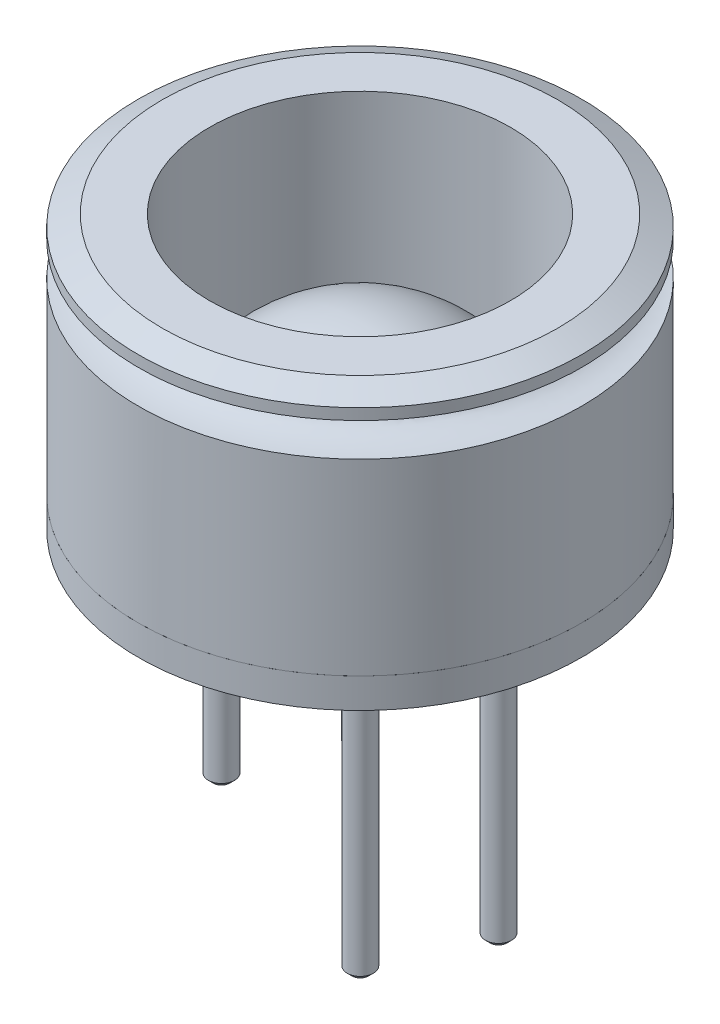
ISO-10303-21;
HEADER;
FILE_DESCRIPTION(('STEP AP214'),'2;1');
FILE_NAME('part.step','',(''),(''),'','','');
FILE_SCHEMA(('AUTOMOTIVE_DESIGN { 1 0 10303 214 1 1 1 1 }'));
ENDSEC;
DATA;
#1=APPLICATION_CONTEXT('core data for automotive mechanical design processes');
#2=APPLICATION_PROTOCOL_DEFINITION('international standard','automotive_design',2000,#1);
#3=PRODUCT_CONTEXT('',#1,'mechanical');
#4=PRODUCT('Part','Part','',(#3));
#5=PRODUCT_RELATED_PRODUCT_CATEGORY('part','',(#4));
#6=PRODUCT_DEFINITION_FORMATION('','',#4);
#7=PRODUCT_DEFINITION_CONTEXT('part definition',#1,'design');
#8=PRODUCT_DEFINITION('design','',#6,#7);
#9=PRODUCT_DEFINITION_SHAPE('','',#8);
#10=(LENGTH_UNIT() NAMED_UNIT(*) SI_UNIT(.MILLI.,.METRE.));
#11=(NAMED_UNIT(*) PLANE_ANGLE_UNIT() SI_UNIT($,.RADIAN.));
#12=(NAMED_UNIT(*) SI_UNIT($,.STERADIAN.) SOLID_ANGLE_UNIT());
#13=UNCERTAINTY_MEASURE_WITH_UNIT(LENGTH_MEASURE(1.E-05),#10,'distance_accuracy_value','');
#14=(GEOMETRIC_REPRESENTATION_CONTEXT(3) GLOBAL_UNCERTAINTY_ASSIGNED_CONTEXT((#13)) GLOBAL_UNIT_ASSIGNED_CONTEXT((#10,
#11,#12)) REPRESENTATION_CONTEXT('',''));
#15=CARTESIAN_POINT('',(0.,0.,0.));
#16=DIRECTION('',(0.,0.,1.));
#17=DIRECTION('',(1.,0.,0.));
#18=AXIS2_PLACEMENT_3D('',#15,#16,#17);
#19=CARTESIAN_POINT('',(0.,5.52740000002085,0.));
#20=DIRECTION('',(0.,-1.,0.));
#21=DIRECTION('',(0.,0.,-1.));
#22=AXIS2_PLACEMENT_3D('',#19,#20,#21);
#23=CONICAL_SURFACE('',#22,4.67,1.1314354395103);
#24=CARTESIAN_POINT('',(0.,5.5274,0.));
#25=DIRECTION('',(0.,-1.,0.));
#26=DIRECTION('',(1.,0.,0.));
#27=AXIS2_PLACEMENT_3D('',#24,#25,#26);
#28=CIRCLE('',#27,4.67);
#29=CARTESIAN_POINT('',(4.67,5.5274,0.));
#30=VERTEX_POINT('',#29);
#31=EDGE_CURVE('P0_E73',#30,#30,#28,.T.);
#32=ORIENTED_EDGE('',*,*,#31,.F.);
#33=EDGE_LOOP('',(#32));
#34=FACE_BOUND('',#33,.T.);
#35=CARTESIAN_POINT('',(0.,5.76240000002659,0.));
#36=DIRECTION('',(0.,1.,0.));
#37=DIRECTION('',(-1.,0.,0.));
#38=AXIS2_PLACEMENT_3D('',#35,#36,#37);
#39=CIRCLE('',#38,4.16999999998779);
#40=CARTESIAN_POINT('',(-4.16999999998779,5.76240000002659,0.));
#41=VERTEX_POINT('',#40);
#42=EDGE_CURVE('P0_E68',#41,#41,#39,.T.);
#43=ORIENTED_EDGE('',*,*,#42,.F.);
#44=EDGE_LOOP('',(#43));
#45=FACE_BOUND('',#44,.T.);
#46=ADVANCED_FACE('P0_F39',(#34,#45),#23,.T.);
#47=CARTESIAN_POINT('',(0.,5.7624,0.));
#48=DIRECTION('',(0.,-1.,0.));
#49=DIRECTION('',(0.,0.,-1.));
#50=AXIS2_PLACEMENT_3D('',#47,#48,#49);
#51=CYLINDRICAL_SURFACE('',#50,4.67);
#52=CARTESIAN_POINT('',(0.,5.2924,0.));
#53=DIRECTION('',(0.,1.,0.));
#54=DIRECTION('',(-1.,0.,0.));
#55=AXIS2_PLACEMENT_3D('',#52,#53,#54);
#56=CIRCLE('',#55,4.67);
#57=CARTESIAN_POINT('',(-4.67,5.2924,0.));
#58=VERTEX_POINT('',#57);
#59=EDGE_CURVE('P0_E63',#58,#58,#56,.T.);
#60=ORIENTED_EDGE('',*,*,#59,.T.);
#61=EDGE_LOOP('',(#60));
#62=FACE_BOUND('',#61,.T.);
#63=ORIENTED_EDGE('',*,*,#31,.T.);
#64=EDGE_LOOP('',(#63));
#65=FACE_BOUND('',#64,.T.);
#66=ADVANCED_FACE('P0_F80',(#62,#65),#51,.T.);
#67=CARTESIAN_POINT('',(0.,5.7624,0.));
#68=DIRECTION('',(0.,1.,0.));
#69=DIRECTION('',(0.,0.,1.));
#70=AXIS2_PLACEMENT_3D('',#67,#68,#69);
#71=PLANE('',#70);
#72=CARTESIAN_POINT('',(0.,5.7624,0.));
#73=DIRECTION('',(0.,-1.,0.));
#74=DIRECTION('',(0.,0.,-1.));
#75=AXIS2_PLACEMENT_3D('',#72,#73,#74);
#76=CIRCLE('',#75,3.17);
#77=CARTESIAN_POINT('',(0.,5.7624,-3.17));
#78=VERTEX_POINT('',#77);
#79=EDGE_CURVE('P0_E43',#78,#78,#76,.T.);
#80=ORIENTED_EDGE('',*,*,#79,.T.);
#81=EDGE_LOOP('',(#80));
#82=FACE_BOUND('',#81,.T.);
#83=ORIENTED_EDGE('',*,*,#42,.T.);
#84=EDGE_LOOP('',(#83));
#85=FACE_BOUND('',#84,.T.);
#86=ADVANCED_FACE('P0_F87',(#82,#85),#71,.T.);
#87=CARTESIAN_POINT('',(0.,5.7624,0.));
#88=DIRECTION('',(0.,-1.,0.));
#89=DIRECTION('',(0.,0.,-1.));
#90=AXIS2_PLACEMENT_3D('',#87,#88,#89);
#91=CYLINDRICAL_SURFACE('',#90,3.17);
#92=CARTESIAN_POINT('',(0.,0.63,0.));
#93=DIRECTION('',(0.,-1.,0.));
#94=DIRECTION('',(0.,0.,-1.));
#95=AXIS2_PLACEMENT_3D('',#92,#93,#94);
#96=CIRCLE('',#95,3.17);
#97=CARTESIAN_POINT('',(0.,0.63,-3.17));
#98=VERTEX_POINT('',#97);
#99=EDGE_CURVE('P0_E54',#98,#98,#96,.T.);
#100=ORIENTED_EDGE('',*,*,#99,.T.);
#101=EDGE_LOOP('',(#100));
#102=FACE_BOUND('',#101,.T.);
#103=ORIENTED_EDGE('',*,*,#79,.F.);
#104=EDGE_LOOP('',(#103));
#105=FACE_BOUND('',#104,.T.);
#106=ADVANCED_FACE('P0_F89',(#102,#105),#91,.F.);
#107=CARTESIAN_POINT('',(0.,4.9399,5.42));
#108=CARTESIAN_POINT('',(10.84,4.9399,5.42));
#109=CARTESIAN_POINT('',(10.84,4.9399,-5.42));
#110=CARTESIAN_POINT('',(0.,4.9399,-5.42));
#111=CARTESIAN_POINT('',(-10.84,4.9399,-5.42));
#112=CARTESIAN_POINT('',(-10.84,4.9399,5.42));
#113=CARTESIAN_POINT('',(0.,4.9399,5.42));
#114=CARTESIAN_POINT('',(0.,4.2349,5.42));
#115=CARTESIAN_POINT('',(10.84,4.2349,5.42));
#116=CARTESIAN_POINT('',(10.84,4.2349,-5.42));
#117=CARTESIAN_POINT('',(0.,4.2349,-5.42));
#118=CARTESIAN_POINT('',(-10.84,4.2349,-5.42));
#119=CARTESIAN_POINT('',(-10.84,4.2349,5.42));
#120=CARTESIAN_POINT('',(0.,4.2349,5.42));
#121=CARTESIAN_POINT('',(0.,4.2349,3.92));
#122=CARTESIAN_POINT('',(7.84,4.2349,3.92));
#123=CARTESIAN_POINT('',(7.84,4.2349,-3.92));
#124=CARTESIAN_POINT('',(0.,4.2349,-3.92));
#125=CARTESIAN_POINT('',(-7.84,4.2349,-3.92));
#126=CARTESIAN_POINT('',(-7.84,4.2349,3.92));
#127=CARTESIAN_POINT('',(0.,4.2349,3.92));
#128=CARTESIAN_POINT('',(0.,4.9399,3.92));
#129=CARTESIAN_POINT('',(7.84,4.9399,3.92));
#130=CARTESIAN_POINT('',(7.84,4.9399,-3.92));
#131=CARTESIAN_POINT('',(0.,4.9399,-3.92));
#132=CARTESIAN_POINT('',(-7.84,4.9399,-3.92));
#133=CARTESIAN_POINT('',(-7.84,4.9399,3.92));
#134=CARTESIAN_POINT('',(0.,4.9399,3.92));
#135=CARTESIAN_POINT('',(0.,5.6449,3.92));
#136=CARTESIAN_POINT('',(7.84,5.6449,3.92));
#137=CARTESIAN_POINT('',(7.84,5.6449,-3.92));
#138=CARTESIAN_POINT('',(0.,5.6449,-3.92));
#139=CARTESIAN_POINT('',(-7.84,5.6449,-3.92));
#140=CARTESIAN_POINT('',(-7.84,5.6449,3.92));
#141=CARTESIAN_POINT('',(0.,5.6449,3.92));
#142=CARTESIAN_POINT('',(0.,5.6449,5.42));
#143=CARTESIAN_POINT('',(10.84,5.6449,5.42));
#144=CARTESIAN_POINT('',(10.84,5.6449,-5.42));
#145=CARTESIAN_POINT('',(0.,5.6449,-5.42));
#146=CARTESIAN_POINT('',(-10.84,5.6449,-5.42));
#147=CARTESIAN_POINT('',(-10.84,5.6449,5.42));
#148=CARTESIAN_POINT('',(0.,5.6449,5.42));
#149=CARTESIAN_POINT('',(0.,4.9399,5.42));
#150=CARTESIAN_POINT('',(10.84,4.9399,5.42));
#151=CARTESIAN_POINT('',(10.84,4.9399,-5.42));
#152=CARTESIAN_POINT('',(0.,4.9399,-5.42));
#153=CARTESIAN_POINT('',(-10.84,4.9399,-5.42));
#154=CARTESIAN_POINT('',(-10.84,4.9399,5.42));
#155=CARTESIAN_POINT('',(0.,4.9399,5.42));
#156=(BOUNDED_SURFACE() B_SPLINE_SURFACE(3,3,((#107,#108,#109,#110,#111,#112,#113),(#114,#115,
#116,#117,#118,#119,#120),(#121,#122,#123,#124,#125,#126,#127),(#128,#129,#130,#131,#132,#133,
#134),(#135,#136,#137,#138,#139,#140,#141),(#142,#143,#144,#145,#146,#147,#148),(#149,#150,#151,
#152,#153,#154,#155)),.UNSPECIFIED.,.T.,.T.,.F.) B_SPLINE_SURFACE_WITH_KNOTS((4,3,4),(4,3,4),
(0.,0.5,1.),(0.,0.5,1.),
.UNSPECIFIED.) GEOMETRIC_REPRESENTATION_ITEM() RATIONAL_B_SPLINE_SURFACE(((1.,0.333333333333333,
0.333333333333333,1.,0.333333333333333,0.333333333333333,1.),(0.333333333333333,
0.111111111111111,0.111111111111111,0.333333333333333,0.111111111111111,0.111111111111111,
0.333333333333333),(0.333333333333333,0.111111111111111,0.111111111111111,0.333333333333333,
0.111111111111111,0.111111111111111,0.333333333333333),(1.,0.333333333333333,0.333333333333333,
1.,0.333333333333333,0.333333333333333,1.),(0.333333333333333,0.111111111111111,
0.111111111111111,0.333333333333333,0.111111111111111,0.111111111111111,0.333333333333333),
(0.333333333333333,0.111111111111111,0.111111111111111,0.333333333333333,0.111111111111111,
0.111111111111111,0.333333333333333),(1.,0.333333333333333,0.333333333333333,1.,
0.333333333333333,0.333333333333333,1.))) REPRESENTATION_ITEM('') SURFACE());
#157=CARTESIAN_POINT('',(0.,4.5874,0.));
#158=DIRECTION('',(0.,-1.,0.));
#159=DIRECTION('',(1.,0.,0.));
#160=AXIS2_PLACEMENT_3D('',#157,#158,#159);
#161=CIRCLE('',#160,4.67);
#162=CARTESIAN_POINT('',(4.67,4.5874,0.));
#163=VERTEX_POINT('',#162);
#164=EDGE_CURVE('P0_E48',#163,#163,#161,.T.);
#165=ORIENTED_EDGE('',*,*,#59,.F.);
#166=EDGE_LOOP('',(#165));
#167=FACE_BOUND('',#166,.T.);
#168=ORIENTED_EDGE('',*,*,#164,.F.);
#169=EDGE_LOOP('',(#168));
#170=FACE_BOUND('',#169,.T.);
#171=ADVANCED_FACE('P0_F95',(#167,#170),#156,.F.);
#172=CARTESIAN_POINT('',(0.,0.63,0.));
#173=DIRECTION('',(0.,1.,0.));
#174=DIRECTION('',(0.,0.,1.));
#175=AXIS2_PLACEMENT_3D('',#172,#173,#174);
#176=PLANE('',#175);
#177=ORIENTED_EDGE('',*,*,#99,.F.);
#178=EDGE_LOOP('',(#177));
#179=FACE_BOUND('',#178,.T.);
#180=CARTESIAN_POINT('',(0.,0.63,0.));
#181=DIRECTION('',(0.,1.,0.));
#182=DIRECTION('',(0.,0.,1.));
#183=AXIS2_PLACEMENT_3D('',#180,#181,#182);
#184=CIRCLE('',#183,4.67);
#185=CARTESIAN_POINT('',(0.,0.63,4.67));
#186=VERTEX_POINT('',#185);
#187=EDGE_CURVE('P0_E10',#186,#186,#184,.T.);
#188=ORIENTED_EDGE('',*,*,#187,.F.);
#189=EDGE_LOOP('',(#188));
#190=FACE_BOUND('',#189,.T.);
#191=ADVANCED_FACE('P0_F99',(#179,#190),#176,.F.);
#192=CARTESIAN_POINT('',(0.,5.7624,0.));
#193=DIRECTION('',(0.,-1.,0.));
#194=DIRECTION('',(0.,0.,-1.));
#195=AXIS2_PLACEMENT_3D('',#192,#193,#194);
#196=CYLINDRICAL_SURFACE('',#195,4.67);
#197=ORIENTED_EDGE('',*,*,#187,.T.);
#198=EDGE_LOOP('',(#197));
#199=FACE_BOUND('',#198,.T.);
#200=ORIENTED_EDGE('',*,*,#164,.T.);
#201=EDGE_LOOP('',(#200));
#202=FACE_BOUND('',#201,.T.);
#203=ADVANCED_FACE('P0_F41',(#199,#202),#196,.T.);
#204=CLOSED_SHELL('',(#46,#66,#86,#106,#171,#191,#203));
#205=MANIFOLD_SOLID_BREP('P0_B2',#204);
#206=CARTESIAN_POINT('',(2.06476688288851,-6.,2.05756901955737));
#207=DIRECTION('',(0.,-1.,0.));
#208=DIRECTION('',(0.,0.,-1.));
#209=AXIS2_PLACEMENT_3D('',#206,#207,#208);
#210=PLANE('',#209);
#211=CARTESIAN_POINT('',(2.06476688288851,-5.99999999997181,2.05756901955737));
#212=DIRECTION('',(0.,1.,0.));
#213=DIRECTION('',(0.,0.,1.));
#214=AXIS2_PLACEMENT_3D('',#211,#212,#213);
#215=CIRCLE('',#214,0.174999999940167);
#216=CARTESIAN_POINT('',(2.06476688288851,-5.99999999997181,2.23256901949753));
#217=VERTEX_POINT('',#216);
#218=EDGE_CURVE('P1_E20',#217,#217,#215,.T.);
#219=ORIENTED_EDGE('',*,*,#218,.F.);
#220=EDGE_LOOP('',(#219));
#221=FACE_BOUND('',#220,.T.);
#222=ADVANCED_FACE('P1_F17',(#221),#210,.T.);
#223=CARTESIAN_POINT('',(2.06476688288851,-5.90000000005375,2.05756901955737));
#224=DIRECTION('',(0.,1.,0.));
#225=DIRECTION('',(0.,0.,1.));
#226=AXIS2_PLACEMENT_3D('',#223,#224,#225);
#227=CONICAL_SURFACE('',#226,0.274999999858222,0.785398163397448);
#228=CARTESIAN_POINT('',(2.06476688288851,-5.9,2.05756901955737));
#229=DIRECTION('',(0.,1.,0.));
#230=DIRECTION('',(0.,0.,1.));
#231=AXIS2_PLACEMENT_3D('',#228,#229,#230);
#232=CIRCLE('',#231,0.275);
#233=CARTESIAN_POINT('',(2.06476688288851,-5.9,2.33256901955736));
#234=VERTEX_POINT('',#233);
#235=EDGE_CURVE('P1_E24',#234,#234,#232,.T.);
#236=ORIENTED_EDGE('',*,*,#235,.F.);
#237=EDGE_LOOP('',(#236));
#238=FACE_BOUND('',#237,.T.);
#239=ORIENTED_EDGE('',*,*,#218,.T.);
#240=EDGE_LOOP('',(#239));
#241=FACE_BOUND('',#240,.T.);
#242=ADVANCED_FACE('P1_F34',(#238,#241),#227,.T.);
#243=CARTESIAN_POINT('',(2.06476688288851,0.,2.05756901955737));
#244=DIRECTION('',(0.,-1.,0.));
#245=DIRECTION('',(0.,0.,-1.));
#246=AXIS2_PLACEMENT_3D('',#243,#244,#245);
#247=PLANE('',#246);
#248=CARTESIAN_POINT('',(2.06476688288851,0.,2.05756901955737));
#249=DIRECTION('',(0.,1.,0.));
#250=DIRECTION('',(0.,0.,1.));
#251=AXIS2_PLACEMENT_3D('',#248,#249,#250);
#252=CIRCLE('',#251,0.275);
#253=CARTESIAN_POINT('',(2.06476688288851,0.,2.33256901955736));
#254=VERTEX_POINT('',#253);
#255=EDGE_CURVE('P1_E10',#254,#254,#252,.F.);
#256=ORIENTED_EDGE('',*,*,#255,.F.);
#257=EDGE_LOOP('',(#256));
#258=FACE_BOUND('',#257,.T.);
#259=ADVANCED_FACE('P1_F41',(#258),#247,.F.);
#260=CARTESIAN_POINT('',(2.06476688288851,-6.,2.05756901955737));
#261=DIRECTION('',(0.,1.,0.));
#262=DIRECTION('',(0.,0.,1.));
#263=AXIS2_PLACEMENT_3D('',#260,#261,#262);
#264=CYLINDRICAL_SURFACE('',#263,0.275);
#265=ORIENTED_EDGE('',*,*,#255,.T.);
#266=EDGE_LOOP('',(#265));
#267=FACE_BOUND('',#266,.T.);
#268=ORIENTED_EDGE('',*,*,#235,.T.);
#269=EDGE_LOOP('',(#268));
#270=FACE_BOUND('',#269,.T.);
#271=ADVANCED_FACE('P1_F43',(#267,#270),#264,.T.);
#272=CLOSED_SHELL('',(#222,#242,#259,#271));
#273=MANIFOLD_SOLID_BREP('P1_B1',#272);
#274=CARTESIAN_POINT('',(0.,0.63,0.));
#275=DIRECTION('',(0.,1.,0.));
#276=DIRECTION('',(0.,0.,1.));
#277=AXIS2_PLACEMENT_3D('',#274,#275,#276);
#278=PLANE('',#277);
#279=DIRECTION('',(-0.923879532507222,0.,-0.382683432374903));
#280=VECTOR('',#279,1.);
#281=CARTESIAN_POINT('',(-5.27398780877437,0.63,-1.75160039813017));
#282=LINE('',#281,#280);
#283=CARTESIAN_POINT('',(-4.9968239490222,0.63,-1.6367953684177));
#284=VERTEX_POINT('',#283);
#285=CARTESIAN_POINT('',(-4.44645181707023,0.63,-1.40882376700415));
#286=VERTEX_POINT('',#285);
#287=EDGE_CURVE('P2_E114',#284,#286,#282,.F.);
#288=ORIENTED_EDGE('',*,*,#287,.T.);
#289=DIRECTION('',(0.382683432374663,0.,-0.923879532507321));
#290=VECTOR('',#289,1.);
#291=CARTESIAN_POINT('',(-4.1403050711705,0.63,-2.14792739301));
#292=LINE('',#291,#290);
#293=CARTESIAN_POINT('',(-4.1403050711705,0.63,-2.14792739301));
#294=VERTEX_POINT('',#293);
#295=EDGE_CURVE('P2_E69',#294,#286,#292,.F.);
#296=ORIENTED_EDGE('',*,*,#295,.F.);
#297=DIRECTION('',(-0.923879532507324,0.,-0.382683432374657));
#298=VECTOR('',#297,1.);
#299=CARTESIAN_POINT('',(-4.96784106287454,0.63,-2.49070402413573));
#300=LINE('',#299,#298);
#301=CARTESIAN_POINT('',(-4.69067720312242,0.63,-2.37589899442336));
#302=VERTEX_POINT('',#301);
#303=EDGE_CURVE('P2_E83',#302,#294,#300,.F.);
#304=ORIENTED_EDGE('',*,*,#303,.F.);
#305=CARTESIAN_POINT('',(-4.80548223283482,0.63,-2.09873513467116));
#306=DIRECTION('',(0.,1.,0.));
#307=DIRECTION('',(0.,0.,1.));
#308=AXIS2_PLACEMENT_3D('',#305,#306,#307);
#309=CIRCLE('',#308,0.3);
#310=CARTESIAN_POINT('',(-5.08264609258698,0.63,-2.21354016438363));
#311=VERTEX_POINT('',#310);
#312=EDGE_CURVE('P2_E85',#311,#302,#309,.F.);
#313=ORIENTED_EDGE('',*,*,#312,.F.);
#314=DIRECTION('',(0.382683432374895,0.,-0.923879532507225));
#315=VECTOR('',#314,1.);
#316=CARTESIAN_POINT('',(-4.96784106287454,0.63,-2.49070402413573));
#317=LINE('',#316,#315);
#318=CARTESIAN_POINT('',(-5.1591827790619,0.63,-2.02876425788233));
#319=VERTEX_POINT('',#318);
#320=EDGE_CURVE('P2_E115',#311,#319,#317,.F.);
#321=ORIENTED_EDGE('',*,*,#320,.T.);
#322=CARTESIAN_POINT('',(-4.88201891930973,0.63,-1.91395922816986));
#323=DIRECTION('',(0.,-1.,0.));
#324=DIRECTION('',(0.,0.,-1.));
#325=AXIS2_PLACEMENT_3D('',#322,#323,#324);
#326=CIRCLE('',#325,0.3);
#327=EDGE_CURVE('P2_E22',#284,#319,#326,.T.);
#328=ORIENTED_EDGE('',*,*,#327,.F.);
#329=EDGE_LOOP('',(#288,#296,#304,#313,#321,#328));
#330=FACE_BOUND('',#329,.T.);
#331=ADVANCED_FACE('P2_F19',(#330),#278,.T.);
#332=CARTESIAN_POINT('',(-4.88201891930973,0.63,-1.91395922816986));
#333=DIRECTION('',(0.,-1.,0.));
#334=DIRECTION('',(0.,0.,-1.));
#335=AXIS2_PLACEMENT_3D('',#332,#333,#334);
#336=CYLINDRICAL_SURFACE('',#335,0.3);
#337=CARTESIAN_POINT('',(-4.88201891930973,0.,-1.91395922816986));
#338=DIRECTION('',(0.,-1.,0.));
#339=DIRECTION('',(0.,0.,-1.));
#340=AXIS2_PLACEMENT_3D('',#337,#338,#339);
#341=CIRCLE('',#340,0.3);
#342=CARTESIAN_POINT('',(-5.1591827790619,0.,-2.02876425788233));
#343=VERTEX_POINT('',#342);
#344=CARTESIAN_POINT('',(-4.9968239490222,0.,-1.6367953684177));
#345=VERTEX_POINT('',#344);
#346=EDGE_CURVE('P2_E101',#343,#345,#341,.F.);
#347=ORIENTED_EDGE('',*,*,#346,.T.);
#348=DIRECTION('',(0.,1.,0.));
#349=VECTOR('',#348,1.);
#350=CARTESIAN_POINT('',(-4.9968239490222,0.63,-1.6367953684177));
#351=LINE('',#350,#349);
#352=EDGE_CURVE('P2_E111',#345,#284,#351,.T.);
#353=ORIENTED_EDGE('',*,*,#352,.T.);
#354=ORIENTED_EDGE('',*,*,#327,.T.);
#355=DIRECTION('',(0.,1.,0.));
#356=VECTOR('',#355,1.);
#357=CARTESIAN_POINT('',(-5.1591827790619,0.63,-2.02876425788233));
#358=LINE('',#357,#356);
#359=EDGE_CURVE('P2_E130',#319,#343,#358,.F.);
#360=ORIENTED_EDGE('',*,*,#359,.T.);
#361=EDGE_LOOP('',(#347,#353,#354,#360));
#362=FACE_BOUND('',#361,.T.);
#363=ADVANCED_FACE('P2_F191',(#362),#336,.T.);
#364=CARTESIAN_POINT('',(-5.27398780877437,0.63,-1.75160039813017));
#365=DIRECTION('',(0.382683432374903,0.,-0.923879532507222));
#366=DIRECTION('',(-0.923879532507222,0.,-0.382683432374903));
#367=AXIS2_PLACEMENT_3D('',#364,#365,#366);
#368=PLANE('',#367);
#369=ORIENTED_EDGE('',*,*,#352,.F.);
#370=DIRECTION('',(0.923879532507222,0.,0.382683432374903));
#371=VECTOR('',#370,1.);
#372=CARTESIAN_POINT('',(-4.9968239490222,0.,-1.6367953684177));
#373=LINE('',#372,#371);
#374=CARTESIAN_POINT('',(-4.44645181707023,0.,-1.40882376700415));
#375=VERTEX_POINT('',#374);
#376=EDGE_CURVE('P2_E99',#345,#375,#373,.T.);
#377=ORIENTED_EDGE('',*,*,#376,.T.);
#378=DIRECTION('',(0.,1.,0.));
#379=VECTOR('',#378,1.);
#380=CARTESIAN_POINT('',(-4.44645181707023,0.63,-1.40882376700415));
#381=LINE('',#380,#379);
#382=EDGE_CURVE('P2_E98',#286,#375,#381,.F.);
#383=ORIENTED_EDGE('',*,*,#382,.F.);
#384=ORIENTED_EDGE('',*,*,#287,.F.);
#385=EDGE_LOOP('',(#369,#377,#383,#384));
#386=FACE_BOUND('',#385,.T.);
#387=ADVANCED_FACE('P2_F182',(#386),#368,.F.);
#388=CARTESIAN_POINT('',(-4.1403050711705,0.63,-2.14792739301));
#389=DIRECTION('',(0.923879532507321,0.,0.382683432374663));
#390=DIRECTION('',(0.382683432374663,0.,-0.923879532507321));
#391=AXIS2_PLACEMENT_3D('',#388,#389,#390);
#392=PLANE('',#391);
#393=ORIENTED_EDGE('',*,*,#295,.T.);
#394=ORIENTED_EDGE('',*,*,#382,.T.);
#395=DIRECTION('',(0.382683432374663,0.,-0.923879532507321));
#396=VECTOR('',#395,1.);
#397=CARTESIAN_POINT('',(-4.44645181707023,0.,-1.40882376700415));
#398=LINE('',#397,#396);
#399=CARTESIAN_POINT('',(-4.1403050711705,0.,-2.14792739301));
#400=VERTEX_POINT('',#399);
#401=EDGE_CURVE('P2_E92',#375,#400,#398,.T.);
#402=ORIENTED_EDGE('',*,*,#401,.T.);
#403=DIRECTION('',(0.,1.,0.));
#404=VECTOR('',#403,1.);
#405=CARTESIAN_POINT('',(-4.1403050711705,0.63,-2.14792739301));
#406=LINE('',#405,#404);
#407=EDGE_CURVE('P2_E77',#294,#400,#406,.F.);
#408=ORIENTED_EDGE('',*,*,#407,.F.);
#409=EDGE_LOOP('',(#393,#394,#402,#408));
#410=FACE_BOUND('',#409,.T.);
#411=ADVANCED_FACE('P2_F96',(#410),#392,.T.);
#412=CARTESIAN_POINT('',(-4.96784106287454,0.63,-2.49070402413573));
#413=DIRECTION('',(0.382683432374657,0.,-0.923879532507324));
#414=DIRECTION('',(-0.923879532507324,0.,-0.382683432374657));
#415=AXIS2_PLACEMENT_3D('',#412,#413,#414);
#416=PLANE('',#415);
#417=ORIENTED_EDGE('',*,*,#303,.T.);
#418=ORIENTED_EDGE('',*,*,#407,.T.);
#419=DIRECTION('',(-0.923879532507324,0.,-0.382683432374657));
#420=VECTOR('',#419,1.);
#421=CARTESIAN_POINT('',(-4.1403050711705,0.,-2.14792739301));
#422=LINE('',#421,#420);
#423=CARTESIAN_POINT('',(-4.69067720312242,0.,-2.37589899442336));
#424=VERTEX_POINT('',#423);
#425=EDGE_CURVE('P2_E81',#400,#424,#422,.T.);
#426=ORIENTED_EDGE('',*,*,#425,.T.);
#427=DIRECTION('',(0.,1.,0.));
#428=VECTOR('',#427,1.);
#429=CARTESIAN_POINT('',(-4.69067720312242,0.63,-2.37589899442336));
#430=LINE('',#429,#428);
#431=EDGE_CURVE('P2_E128',#302,#424,#430,.F.);
#432=ORIENTED_EDGE('',*,*,#431,.F.);
#433=EDGE_LOOP('',(#417,#418,#426,#432));
#434=FACE_BOUND('',#433,.T.);
#435=ADVANCED_FACE('P2_F79',(#434),#416,.T.);
#436=CARTESIAN_POINT('',(-4.80548223283482,0.63,-2.09873513467116));
#437=DIRECTION('',(0.,1.,0.));
#438=DIRECTION('',(0.,0.,1.));
#439=AXIS2_PLACEMENT_3D('',#436,#437,#438);
#440=CYLINDRICAL_SURFACE('',#439,0.3);
#441=CARTESIAN_POINT('',(-4.80548223283482,0.,-2.09873513467116));
#442=DIRECTION('',(0.,1.,0.));
#443=DIRECTION('',(0.,0.,1.));
#444=AXIS2_PLACEMENT_3D('',#441,#442,#443);
#445=CIRCLE('',#444,0.3);
#446=CARTESIAN_POINT('',(-5.08264609258698,0.,-2.21354016438363));
#447=VERTEX_POINT('',#446);
#448=EDGE_CURVE('P2_E28',#424,#447,#445,.T.);
#449=ORIENTED_EDGE('',*,*,#448,.T.);
#450=DIRECTION('',(0.,1.,0.));
#451=VECTOR('',#450,1.);
#452=CARTESIAN_POINT('',(-5.08264609258698,0.63,-2.21354016438363));
#453=LINE('',#452,#451);
#454=EDGE_CURVE('P2_E36',#447,#311,#453,.T.);
#455=ORIENTED_EDGE('',*,*,#454,.T.);
#456=ORIENTED_EDGE('',*,*,#312,.T.);
#457=ORIENTED_EDGE('',*,*,#431,.T.);
#458=EDGE_LOOP('',(#449,#455,#456,#457));
#459=FACE_BOUND('',#458,.T.);
#460=ADVANCED_FACE('P2_F139',(#459),#440,.T.);
#461=CARTESIAN_POINT('',(-4.96784106287454,0.63,-2.49070402413573));
#462=DIRECTION('',(0.923879532507225,0.,0.382683432374895));
#463=DIRECTION('',(0.382683432374895,0.,-0.923879532507225));
#464=AXIS2_PLACEMENT_3D('',#461,#462,#463);
#465=PLANE('',#464);
#466=ORIENTED_EDGE('',*,*,#454,.F.);
#467=DIRECTION('',(-0.382683432374895,0.,0.923879532507225));
#468=VECTOR('',#467,1.);
#469=CARTESIAN_POINT('',(-5.08264609258698,0.,-2.21354016438363));
#470=LINE('',#469,#468);
#471=EDGE_CURVE('P2_E11',#447,#343,#470,.T.);
#472=ORIENTED_EDGE('',*,*,#471,.T.);
#473=ORIENTED_EDGE('',*,*,#359,.F.);
#474=ORIENTED_EDGE('',*,*,#320,.F.);
#475=EDGE_LOOP('',(#466,#472,#473,#474));
#476=FACE_BOUND('',#475,.T.);
#477=ADVANCED_FACE('P2_F141',(#476),#465,.F.);
#478=CARTESIAN_POINT('',(0.,0.,0.));
#479=DIRECTION('',(0.,1.,0.));
#480=DIRECTION('',(0.,0.,1.));
#481=AXIS2_PLACEMENT_3D('',#478,#479,#480);
#482=PLANE('',#481);
#483=ORIENTED_EDGE('',*,*,#448,.F.);
#484=ORIENTED_EDGE('',*,*,#425,.F.);
#485=ORIENTED_EDGE('',*,*,#401,.F.);
#486=ORIENTED_EDGE('',*,*,#376,.F.);
#487=ORIENTED_EDGE('',*,*,#346,.F.);
#488=ORIENTED_EDGE('',*,*,#471,.F.);
#489=EDGE_LOOP('',(#483,#484,#485,#486,#487,#488));
#490=FACE_BOUND('',#489,.T.);
#491=ADVANCED_FACE('P2_F90',(#490),#482,.F.);
#492=CLOSED_SHELL('',(#331,#363,#387,#411,#435,#460,#477,#491));
#493=MANIFOLD_SOLID_BREP('P2_B1',#492);
#494=CARTESIAN_POINT('',(2.92,-0.1,0.));
#495=DIRECTION('',(0.,-1.,0.));
#496=DIRECTION('',(0.,0.,-1.));
#497=AXIS2_PLACEMENT_3D('',#494,#495,#496);
#498=PLANE('',#497);
#499=CARTESIAN_POINT('',(2.92,-0.1,0.));
#500=DIRECTION('',(0.,1.,0.));
#501=DIRECTION('',(0.,0.,-1.));
#502=AXIS2_PLACEMENT_3D('',#499,#500,#501);
#503=CIRCLE('',#502,0.386794919243112);
#504=CARTESIAN_POINT('',(2.92,-0.1,-0.386794919243112));
#505=VERTEX_POINT('',#504);
#506=CARTESIAN_POINT('',(2.92,-0.1,0.386794919243112));
#507=VERTEX_POINT('',#506);
#508=EDGE_CURVE('P3_E29',#505,#507,#503,.T.);
#509=ORIENTED_EDGE('',*,*,#508,.F.);
#510=CARTESIAN_POINT('',(2.92,-0.1,0.));
#511=DIRECTION('',(0.,1.,0.));
#512=DIRECTION('',(0.,0.,1.));
#513=AXIS2_PLACEMENT_3D('',#510,#511,#512);
#514=CIRCLE('',#513,0.386794919243112);
#515=EDGE_CURVE('P3_E38',#507,#505,#514,.T.);
#516=ORIENTED_EDGE('',*,*,#515,.F.);
#517=EDGE_LOOP('',(#509,#516));
#518=FACE_BOUND('',#517,.T.);
#519=ADVANCED_FACE('P3_F19',(#518),#498,.T.);
#520=CARTESIAN_POINT('',(2.92,0.1,0.));
#521=DIRECTION('',(0.,1.,0.));
#522=DIRECTION('',(0.,0.,1.));
#523=AXIS2_PLACEMENT_3D('',#520,#521,#522);
#524=TOROIDAL_SURFACE('',#523,0.386794919243112,0.2);
#525=ORIENTED_EDGE('',*,*,#515,.T.);
#526=ORIENTED_EDGE('',*,*,#508,.T.);
#527=EDGE_LOOP('',(#525,#526));
#528=FACE_BOUND('',#527,.T.);
#529=CARTESIAN_POINT('',(2.92,0.,0.));
#530=DIRECTION('',(0.,1.,0.));
#531=DIRECTION('',(0.,0.,1.));
#532=AXIS2_PLACEMENT_3D('',#529,#530,#531);
#533=CIRCLE('',#532,0.56);
#534=CARTESIAN_POINT('',(2.92,0.,0.56));
#535=VERTEX_POINT('',#534);
#536=EDGE_CURVE('P3_E11',#535,#535,#533,.F.);
#537=ORIENTED_EDGE('',*,*,#536,.T.);
#538=EDGE_LOOP('',(#537));
#539=FACE_BOUND('',#538,.T.);
#540=ADVANCED_FACE('P3_F39',(#528,#539),#524,.T.);
#541=CARTESIAN_POINT('',(2.92,0.,0.));
#542=DIRECTION('',(0.,-1.,0.));
#543=DIRECTION('',(0.,0.,-1.));
#544=AXIS2_PLACEMENT_3D('',#541,#542,#543);
#545=PLANE('',#544);
#546=ORIENTED_EDGE('',*,*,#536,.F.);
#547=EDGE_LOOP('',(#546));
#548=FACE_BOUND('',#547,.T.);
#549=ADVANCED_FACE('P3_F73',(#548),#545,.F.);
#550=CLOSED_SHELL('',(#519,#540,#549));
#551=MANIFOLD_SOLID_BREP('P3_B1',#550);
#552=CARTESIAN_POINT('',(-2.92,-6.,0.));
#553=DIRECTION('',(0.,-1.,0.));
#554=DIRECTION('',(0.,0.,-1.));
#555=AXIS2_PLACEMENT_3D('',#552,#553,#554);
#556=PLANE('',#555);
#557=CARTESIAN_POINT('',(-2.92,-5.99999999997181,0.));
#558=DIRECTION('',(0.,1.,0.));
#559=DIRECTION('',(-1.,0.,0.));
#560=AXIS2_PLACEMENT_3D('',#557,#558,#559);
#561=CIRCLE('',#560,0.175000000012915);
#562=CARTESIAN_POINT('',(-3.09500000001291,-5.99999999997181,0.));
#563=VERTEX_POINT('',#562);
#564=EDGE_CURVE('P4_E20',#563,#563,#561,.T.);
#565=ORIENTED_EDGE('',*,*,#564,.F.);
#566=EDGE_LOOP('',(#565));
#567=FACE_BOUND('',#566,.T.);
#568=ADVANCED_FACE('P4_F17',(#567),#556,.T.);
#569=CARTESIAN_POINT('',(-2.92,-5.89999999999691,0.));
#570=DIRECTION('',(0.,1.,0.));
#571=DIRECTION('',(-1.,0.,0.));
#572=AXIS2_PLACEMENT_3D('',#569,#570,#571);
#573=CONICAL_SURFACE('',#572,0.274999999930969,0.785398163113231);
#574=CARTESIAN_POINT('',(-2.92,-5.9,0.));
#575=DIRECTION('',(0.,1.,0.));
#576=DIRECTION('',(0.,0.,1.));
#577=AXIS2_PLACEMENT_3D('',#574,#575,#576);
#578=CIRCLE('',#577,0.275);
#579=CARTESIAN_POINT('',(-2.92,-5.9,0.275));
#580=VERTEX_POINT('',#579);
#581=EDGE_CURVE('P4_E24',#580,#580,#578,.T.);
#582=ORIENTED_EDGE('',*,*,#581,.F.);
#583=EDGE_LOOP('',(#582));
#584=FACE_BOUND('',#583,.T.);
#585=ORIENTED_EDGE('',*,*,#564,.T.);
#586=EDGE_LOOP('',(#585));
#587=FACE_BOUND('',#586,.T.);
#588=ADVANCED_FACE('P4_F34',(#584,#587),#573,.T.);
#589=CARTESIAN_POINT('',(-2.92,0.,0.));
#590=DIRECTION('',(0.,-1.,0.));
#591=DIRECTION('',(0.,0.,-1.));
#592=AXIS2_PLACEMENT_3D('',#589,#590,#591);
#593=PLANE('',#592);
#594=CARTESIAN_POINT('',(-2.92,0.,0.));
#595=DIRECTION('',(0.,1.,0.));
#596=DIRECTION('',(0.,0.,1.));
#597=AXIS2_PLACEMENT_3D('',#594,#595,#596);
#598=CIRCLE('',#597,0.275);
#599=CARTESIAN_POINT('',(-2.92,0.,0.275));
#600=VERTEX_POINT('',#599);
#601=EDGE_CURVE('P4_E10',#600,#600,#598,.F.);
#602=ORIENTED_EDGE('',*,*,#601,.F.);
#603=EDGE_LOOP('',(#602));
#604=FACE_BOUND('',#603,.T.);
#605=ADVANCED_FACE('P4_F41',(#604),#593,.F.);
#606=CARTESIAN_POINT('',(-2.92,-6.,0.));
#607=DIRECTION('',(0.,1.,0.));
#608=DIRECTION('',(0.,0.,1.));
#609=AXIS2_PLACEMENT_3D('',#606,#607,#608);
#610=CYLINDRICAL_SURFACE('',#609,0.275);
#611=ORIENTED_EDGE('',*,*,#601,.T.);
#612=EDGE_LOOP('',(#611));
#613=FACE_BOUND('',#612,.T.);
#614=ORIENTED_EDGE('',*,*,#581,.T.);
#615=EDGE_LOOP('',(#614));
#616=FACE_BOUND('',#615,.T.);
#617=ADVANCED_FACE('P4_F43',(#613,#616),#610,.T.);
#618=CLOSED_SHELL('',(#568,#588,#605,#617));
#619=MANIFOLD_SOLID_BREP('P4_B1',#618);
#620=CARTESIAN_POINT('',(-2.06475180106472,-6.,-2.06475180106472));
#621=DIRECTION('',(0.,-1.,0.));
#622=DIRECTION('',(0.,0.,-1.));
#623=AXIS2_PLACEMENT_3D('',#620,#621,#622);
#624=PLANE('',#623);
#625=CARTESIAN_POINT('',(-2.06475180106472,-6.00000000002865,-2.06475180106472));
#626=DIRECTION('',(0.,1.,0.));
#627=DIRECTION('',(0.,0.,1.));
#628=AXIS2_PLACEMENT_3D('',#625,#626,#627);
#629=CIRCLE('',#628,0.174999999948883);
#630=CARTESIAN_POINT('',(-2.06475180106472,-6.00000000002865,-1.88975180111584));
#631=VERTEX_POINT('',#630);
#632=EDGE_CURVE('P5_E20',#631,#631,#629,.T.);
#633=ORIENTED_EDGE('',*,*,#632,.F.);
#634=EDGE_LOOP('',(#633));
#635=FACE_BOUND('',#634,.T.);
#636=ADVANCED_FACE('P5_F17',(#635),#624,.T.);
#637=CARTESIAN_POINT('',(-2.06475180106472,-5.90000000005375,-2.06475180106472));
#638=DIRECTION('',(0.,1.,0.));
#639=DIRECTION('',(0.,0.,1.));
#640=AXIS2_PLACEMENT_3D('',#637,#638,#639);
#641=CONICAL_SURFACE('',#640,0.274999999923781,0.785398163397448);
#642=CARTESIAN_POINT('',(-2.06475180106472,-5.9,-2.06475180106472));
#643=DIRECTION('',(0.,1.,0.));
#644=DIRECTION('',(0.,0.,1.));
#645=AXIS2_PLACEMENT_3D('',#642,#643,#644);
#646=CIRCLE('',#645,0.275);
#647=CARTESIAN_POINT('',(-2.06475180106472,-5.9,-1.78975180106472));
#648=VERTEX_POINT('',#647);
#649=EDGE_CURVE('P5_E24',#648,#648,#646,.T.);
#650=ORIENTED_EDGE('',*,*,#649,.F.);
#651=EDGE_LOOP('',(#650));
#652=FACE_BOUND('',#651,.T.);
#653=ORIENTED_EDGE('',*,*,#632,.T.);
#654=EDGE_LOOP('',(#653));
#655=FACE_BOUND('',#654,.T.);
#656=ADVANCED_FACE('P5_F34',(#652,#655),#641,.T.);
#657=CARTESIAN_POINT('',(-2.06475180106472,0.,-2.06475180106472));
#658=DIRECTION('',(0.,-1.,0.));
#659=DIRECTION('',(0.,0.,-1.));
#660=AXIS2_PLACEMENT_3D('',#657,#658,#659);
#661=PLANE('',#660);
#662=CARTESIAN_POINT('',(-2.06475180106472,0.,-2.06475180106472));
#663=DIRECTION('',(0.,1.,0.));
#664=DIRECTION('',(0.,0.,1.));
#665=AXIS2_PLACEMENT_3D('',#662,#663,#664);
#666=CIRCLE('',#665,0.275);
#667=CARTESIAN_POINT('',(-2.06475180106472,0.,-1.78975180106472));
#668=VERTEX_POINT('',#667);
#669=EDGE_CURVE('P5_E10',#668,#668,#666,.F.);
#670=ORIENTED_EDGE('',*,*,#669,.F.);
#671=EDGE_LOOP('',(#670));
#672=FACE_BOUND('',#671,.T.);
#673=ADVANCED_FACE('P5_F41',(#672),#661,.F.);
#674=CARTESIAN_POINT('',(-2.06475180106472,-6.,-2.06475180106472));
#675=DIRECTION('',(0.,1.,0.));
#676=DIRECTION('',(0.,0.,1.));
#677=AXIS2_PLACEMENT_3D('',#674,#675,#676);
#678=CYLINDRICAL_SURFACE('',#677,0.275);
#679=ORIENTED_EDGE('',*,*,#669,.T.);
#680=EDGE_LOOP('',(#679));
#681=FACE_BOUND('',#680,.T.);
#682=ORIENTED_EDGE('',*,*,#649,.T.);
#683=EDGE_LOOP('',(#682));
#684=FACE_BOUND('',#683,.T.);
#685=ADVANCED_FACE('P5_F43',(#681,#684),#678,.T.);
#686=CLOSED_SHELL('',(#636,#656,#673,#685));
#687=MANIFOLD_SOLID_BREP('P5_B1',#686);
#688=CARTESIAN_POINT('',(-2.06475180106472,-0.1,-2.06475180106472));
#689=DIRECTION('',(0.,-1.,0.));
#690=DIRECTION('',(0.,0.,-1.));
#691=AXIS2_PLACEMENT_3D('',#688,#689,#690);
#692=PLANE('',#691);
#693=CARTESIAN_POINT('',(-2.06475180106472,-0.1,-2.06475180106472));
#694=DIRECTION('',(0.,1.,0.));
#695=DIRECTION('',(0.,0.,-1.));
#696=AXIS2_PLACEMENT_3D('',#693,#694,#695);
#697=CIRCLE('',#696,0.386794919243112);
#698=CARTESIAN_POINT('',(-2.06475180106472,-0.1,-2.45154672030783));
#699=VERTEX_POINT('',#698);
#700=CARTESIAN_POINT('',(-2.06475180106472,-0.1,-1.67795688182161));
#701=VERTEX_POINT('',#700);
#702=EDGE_CURVE('P6_E28',#699,#701,#697,.T.);
#703=ORIENTED_EDGE('',*,*,#702,.F.);
#704=CARTESIAN_POINT('',(-2.06475180106472,-0.1,-2.06475180106472));
#705=DIRECTION('',(0.,1.,0.));
#706=DIRECTION('',(0.,0.,1.));
#707=AXIS2_PLACEMENT_3D('',#704,#705,#706);
#708=CIRCLE('',#707,0.386794919243112);
#709=EDGE_CURVE('P6_E37',#701,#699,#708,.T.);
#710=ORIENTED_EDGE('',*,*,#709,.F.);
#711=EDGE_LOOP('',(#703,#710));
#712=FACE_BOUND('',#711,.T.);
#713=ADVANCED_FACE('P6_F18',(#712),#692,.T.);
#714=CARTESIAN_POINT('',(-2.06475180106472,0.1,-2.06475180106472));
#715=DIRECTION('',(0.,1.,0.));
#716=DIRECTION('',(0.,0.,1.));
#717=AXIS2_PLACEMENT_3D('',#714,#715,#716);
#718=TOROIDAL_SURFACE('',#717,0.386794919243112,0.2);
#719=ORIENTED_EDGE('',*,*,#709,.T.);
#720=ORIENTED_EDGE('',*,*,#702,.T.);
#721=EDGE_LOOP('',(#719,#720));
#722=FACE_BOUND('',#721,.T.);
#723=CARTESIAN_POINT('',(-2.06475180106472,0.,-2.06475180106472));
#724=DIRECTION('',(0.,1.,0.));
#725=DIRECTION('',(0.,0.,1.));
#726=AXIS2_PLACEMENT_3D('',#723,#724,#725);
#727=CIRCLE('',#726,0.56);
#728=CARTESIAN_POINT('',(-2.06475180106472,0.,-1.50475180106472));
#729=VERTEX_POINT('',#728);
#730=EDGE_CURVE('P6_E10',#729,#729,#727,.F.);
#731=ORIENTED_EDGE('',*,*,#730,.T.);
#732=EDGE_LOOP('',(#731));
#733=FACE_BOUND('',#732,.T.);
#734=ADVANCED_FACE('P6_F38',(#722,#733),#718,.T.);
#735=CARTESIAN_POINT('',(-2.06475180106472,0.,-2.06475180106472));
#736=DIRECTION('',(0.,-1.,0.));
#737=DIRECTION('',(0.,0.,-1.));
#738=AXIS2_PLACEMENT_3D('',#735,#736,#737);
#739=PLANE('',#738);
#740=ORIENTED_EDGE('',*,*,#730,.F.);
#741=EDGE_LOOP('',(#740));
#742=FACE_BOUND('',#741,.T.);
#743=ADVANCED_FACE('P6_F72',(#742),#739,.F.);
#744=CLOSED_SHELL('',(#713,#734,#743));
#745=MANIFOLD_SOLID_BREP('P6_B1',#744);
#746=CARTESIAN_POINT('',(-2.92,-0.1,0.));
#747=DIRECTION('',(0.,-1.,0.));
#748=DIRECTION('',(0.,0.,-1.));
#749=AXIS2_PLACEMENT_3D('',#746,#747,#748);
#750=PLANE('',#749);
#751=CARTESIAN_POINT('',(-2.92,-0.1,0.));
#752=DIRECTION('',(0.,1.,0.));
#753=DIRECTION('',(0.,0.,-1.));
#754=AXIS2_PLACEMENT_3D('',#751,#752,#753);
#755=CIRCLE('',#754,0.386794919243112);
#756=CARTESIAN_POINT('',(-2.92,-0.1,-0.386794919243112));
#757=VERTEX_POINT('',#756);
#758=CARTESIAN_POINT('',(-2.92,-0.1,0.386794919243112));
#759=VERTEX_POINT('',#758);
#760=EDGE_CURVE('P7_E29',#757,#759,#755,.T.);
#761=ORIENTED_EDGE('',*,*,#760,.F.);
#762=CARTESIAN_POINT('',(-2.92,-0.1,0.));
#763=DIRECTION('',(0.,1.,0.));
#764=DIRECTION('',(0.,0.,1.));
#765=AXIS2_PLACEMENT_3D('',#762,#763,#764);
#766=CIRCLE('',#765,0.386794919243112);
#767=EDGE_CURVE('P7_E38',#759,#757,#766,.T.);
#768=ORIENTED_EDGE('',*,*,#767,.F.);
#769=EDGE_LOOP('',(#761,#768));
#770=FACE_BOUND('',#769,.T.);
#771=ADVANCED_FACE('P7_F19',(#770),#750,.T.);
#772=CARTESIAN_POINT('',(-2.92,0.1,0.));
#773=DIRECTION('',(0.,1.,0.));
#774=DIRECTION('',(0.,0.,1.));
#775=AXIS2_PLACEMENT_3D('',#772,#773,#774);
#776=TOROIDAL_SURFACE('',#775,0.386794919243112,0.2);
#777=ORIENTED_EDGE('',*,*,#767,.T.);
#778=ORIENTED_EDGE('',*,*,#760,.T.);
#779=EDGE_LOOP('',(#777,#778));
#780=FACE_BOUND('',#779,.T.);
#781=CARTESIAN_POINT('',(-2.92,0.,0.));
#782=DIRECTION('',(0.,1.,0.));
#783=DIRECTION('',(0.,0.,1.));
#784=AXIS2_PLACEMENT_3D('',#781,#782,#783);
#785=CIRCLE('',#784,0.56);
#786=CARTESIAN_POINT('',(-2.92,0.,0.56));
#787=VERTEX_POINT('',#786);
#788=EDGE_CURVE('P7_E11',#787,#787,#785,.F.);
#789=ORIENTED_EDGE('',*,*,#788,.T.);
#790=EDGE_LOOP('',(#789));
#791=FACE_BOUND('',#790,.T.);
#792=ADVANCED_FACE('P7_F39',(#780,#791),#776,.T.);
#793=CARTESIAN_POINT('',(-2.92,0.,0.));
#794=DIRECTION('',(0.,-1.,0.));
#795=DIRECTION('',(0.,0.,-1.));
#796=AXIS2_PLACEMENT_3D('',#793,#794,#795);
#797=PLANE('',#796);
#798=ORIENTED_EDGE('',*,*,#788,.F.);
#799=EDGE_LOOP('',(#798));
#800=FACE_BOUND('',#799,.T.);
#801=ADVANCED_FACE('P7_F73',(#800),#797,.F.);
#802=CLOSED_SHELL('',(#771,#792,#801));
#803=MANIFOLD_SOLID_BREP('P7_B1',#802);
#804=CARTESIAN_POINT('',(2.06476688288851,-0.1,2.05756901955737));
#805=DIRECTION('',(0.,-1.,0.));
#806=DIRECTION('',(0.,0.,-1.));
#807=AXIS2_PLACEMENT_3D('',#804,#805,#806);
#808=PLANE('',#807);
#809=CARTESIAN_POINT('',(2.06476688288851,-0.1,2.05756901955737));
#810=DIRECTION('',(0.,1.,0.));
#811=DIRECTION('',(0.,0.,-1.));
#812=AXIS2_PLACEMENT_3D('',#809,#810,#811);
#813=CIRCLE('',#812,0.386794919243112);
#814=CARTESIAN_POINT('',(2.06476688288851,-0.1,1.67077410031425));
#815=VERTEX_POINT('',#814);
#816=CARTESIAN_POINT('',(2.06476688288851,-0.1,2.44436393880048));
#817=VERTEX_POINT('',#816);
#818=EDGE_CURVE('P8_E29',#815,#817,#813,.T.);
#819=ORIENTED_EDGE('',*,*,#818,.F.);
#820=CARTESIAN_POINT('',(2.06476688288851,-0.1,2.05756901955737));
#821=DIRECTION('',(0.,1.,0.));
#822=DIRECTION('',(0.,0.,1.));
#823=AXIS2_PLACEMENT_3D('',#820,#821,#822);
#824=CIRCLE('',#823,0.386794919243112);
#825=EDGE_CURVE('P8_E38',#817,#815,#824,.T.);
#826=ORIENTED_EDGE('',*,*,#825,.F.);
#827=EDGE_LOOP('',(#819,#826));
#828=FACE_BOUND('',#827,.T.);
#829=ADVANCED_FACE('P8_F19',(#828),#808,.T.);
#830=CARTESIAN_POINT('',(2.06476688288851,0.1,2.05756901955737));
#831=DIRECTION('',(0.,1.,0.));
#832=DIRECTION('',(0.,0.,1.));
#833=AXIS2_PLACEMENT_3D('',#830,#831,#832);
#834=TOROIDAL_SURFACE('',#833,0.386794919243112,0.2);
#835=ORIENTED_EDGE('',*,*,#825,.T.);
#836=ORIENTED_EDGE('',*,*,#818,.T.);
#837=EDGE_LOOP('',(#835,#836));
#838=FACE_BOUND('',#837,.T.);
#839=CARTESIAN_POINT('',(2.06476688288851,0.,2.05756901955737));
#840=DIRECTION('',(0.,1.,0.));
#841=DIRECTION('',(0.,0.,1.));
#842=AXIS2_PLACEMENT_3D('',#839,#840,#841);
#843=CIRCLE('',#842,0.56);
#844=CARTESIAN_POINT('',(2.06476688288851,0.,2.61756901955737));
#845=VERTEX_POINT('',#844);
#846=EDGE_CURVE('P8_E11',#845,#845,#843,.F.);
#847=ORIENTED_EDGE('',*,*,#846,.T.);
#848=EDGE_LOOP('',(#847));
#849=FACE_BOUND('',#848,.T.);
#850=ADVANCED_FACE('P8_F39',(#838,#849),#834,.T.);
#851=CARTESIAN_POINT('',(2.06476688288851,0.,2.05756901955737));
#852=DIRECTION('',(0.,-1.,0.));
#853=DIRECTION('',(0.,0.,-1.));
#854=AXIS2_PLACEMENT_3D('',#851,#852,#853);
#855=PLANE('',#854);
#856=ORIENTED_EDGE('',*,*,#846,.F.);
#857=EDGE_LOOP('',(#856));
#858=FACE_BOUND('',#857,.T.);
#859=ADVANCED_FACE('P8_F73',(#858),#855,.F.);
#860=CLOSED_SHELL('',(#829,#850,#859));
#861=MANIFOLD_SOLID_BREP('P8_B1',#860);
#862=CARTESIAN_POINT('',(0.,0.,0.));
#863=DIRECTION('',(0.,1.,0.));
#864=DIRECTION('',(0.,0.,1.));
#865=AXIS2_PLACEMENT_3D('',#862,#863,#864);
#866=PLANE('',#865);
#867=CARTESIAN_POINT('',(0.,0.,0.));
#868=DIRECTION('',(0.,-1.,0.));
#869=DIRECTION('',(0.,0.,-1.));
#870=AXIS2_PLACEMENT_3D('',#867,#868,#869);
#871=CIRCLE('',#870,4.67);
#872=CARTESIAN_POINT('',(0.,0.,-4.67));
#873=VERTEX_POINT('',#872);
#874=EDGE_CURVE('P9_E20',#873,#873,#871,.F.);
#875=ORIENTED_EDGE('',*,*,#874,.F.);
#876=EDGE_LOOP('',(#875));
#877=FACE_BOUND('',#876,.T.);
#878=ADVANCED_FACE('P9_F17',(#877),#866,.F.);
#879=CARTESIAN_POINT('',(0.,0.63,0.));
#880=DIRECTION('',(0.,-1.,0.));
#881=DIRECTION('',(0.,0.,-1.));
#882=AXIS2_PLACEMENT_3D('',#879,#880,#881);
#883=CYLINDRICAL_SURFACE('',#882,4.67);
#884=ORIENTED_EDGE('',*,*,#874,.T.);
#885=EDGE_LOOP('',(#884));
#886=FACE_BOUND('',#885,.T.);
#887=CARTESIAN_POINT('',(0.,0.63,0.));
#888=DIRECTION('',(0.,-1.,0.));
#889=DIRECTION('',(0.,0.,-1.));
#890=AXIS2_PLACEMENT_3D('',#887,#888,#889);
#891=CIRCLE('',#890,4.67);
#892=CARTESIAN_POINT('',(0.,0.63,-4.67));
#893=VERTEX_POINT('',#892);
#894=EDGE_CURVE('P9_E10',#893,#893,#891,.F.);
#895=ORIENTED_EDGE('',*,*,#894,.F.);
#896=EDGE_LOOP('',(#895));
#897=FACE_BOUND('',#896,.T.);
#898=ADVANCED_FACE('P9_F29',(#886,#897),#883,.T.);
#899=CARTESIAN_POINT('',(0.,0.63,0.));
#900=DIRECTION('',(0.,1.,0.));
#901=DIRECTION('',(0.,0.,1.));
#902=AXIS2_PLACEMENT_3D('',#899,#900,#901);
#903=PLANE('',#902);
#904=ORIENTED_EDGE('',*,*,#894,.T.);
#905=EDGE_LOOP('',(#904));
#906=FACE_BOUND('',#905,.T.);
#907=ADVANCED_FACE('P9_F37',(#906),#903,.T.);
#908=CLOSED_SHELL('',(#878,#898,#907));
#909=MANIFOLD_SOLID_BREP('P9_B1',#908);
#910=CARTESIAN_POINT('',(0.,0.63,0.));
#911=DIRECTION('',(0.,-1.,0.));
#912=DIRECTION('',(0.,0.,-1.));
#913=AXIS2_PLACEMENT_3D('',#910,#911,#912);
#914=PLANE('',#913);
#915=CARTESIAN_POINT('',(0.,0.63,0.));
#916=DIRECTION('',(0.,1.,0.));
#917=DIRECTION('',(0.,0.,1.));
#918=AXIS2_PLACEMENT_3D('',#915,#916,#917);
#919=CIRCLE('',#918,3.17);
#920=CARTESIAN_POINT('',(0.,0.629999999999978,3.17));
#921=VERTEX_POINT('',#920);
#922=CARTESIAN_POINT('',(0.,0.630000000000022,-3.17));
#923=VERTEX_POINT('',#922);
#924=EDGE_CURVE('P10_E19',#921,#923,#919,.T.);
#925=ORIENTED_EDGE('',*,*,#924,.F.);
#926=CARTESIAN_POINT('',(0.,0.63,0.));
#927=DIRECTION('',(0.,-1.,0.));
#928=DIRECTION('',(0.,0.,1.));
#929=AXIS2_PLACEMENT_3D('',#926,#927,#928);
#930=CIRCLE('',#929,3.17);
#931=EDGE_CURVE('P10_E11',#923,#921,#930,.F.);
#932=ORIENTED_EDGE('',*,*,#931,.F.);
#933=EDGE_LOOP('',(#925,#932));
#934=FACE_BOUND('',#933,.T.);
#935=ADVANCED_FACE('P10_F16',(#934),#914,.T.);
#936=CARTESIAN_POINT('',(0.,0.63,0.));
#937=DIRECTION('',(0.,0.,1.));
#938=DIRECTION('',(1.,0.,0.));
#939=AXIS2_PLACEMENT_3D('',#936,#937,#938);
#940=SPHERICAL_SURFACE('',#939,3.17);
#941=ORIENTED_EDGE('',*,*,#924,.T.);
#942=ORIENTED_EDGE('',*,*,#931,.T.);
#943=EDGE_LOOP('',(#941,#942));
#944=FACE_BOUND('',#943,.T.);
#945=ADVANCED_FACE('P10_F32',(#944),#940,.T.);
#946=CLOSED_SHELL('',(#935,#945));
#947=MANIFOLD_SOLID_BREP('P10_B1',#946);
#948=CARTESIAN_POINT('',(2.92,-6.,0.));
#949=DIRECTION('',(0.,-1.,0.));
#950=DIRECTION('',(0.,0.,-1.));
#951=AXIS2_PLACEMENT_3D('',#948,#949,#950);
#952=PLANE('',#951);
#953=CARTESIAN_POINT('',(2.92,-5.99999999997181,0.));
#954=DIRECTION('',(0.,1.,0.));
#955=DIRECTION('',(-1.,0.,0.));
#956=AXIS2_PLACEMENT_3D('',#953,#954,#955);
#957=CIRCLE('',#956,0.175000000012915);
#958=CARTESIAN_POINT('',(2.74499999998709,-5.99999999997181,0.));
#959=VERTEX_POINT('',#958);
#960=EDGE_CURVE('P11_E20',#959,#959,#957,.T.);
#961=ORIENTED_EDGE('',*,*,#960,.F.);
#962=EDGE_LOOP('',(#961));
#963=FACE_BOUND('',#962,.T.);
#964=ADVANCED_FACE('P11_F17',(#963),#952,.T.);
#965=CARTESIAN_POINT('',(2.92,-5.89999999999691,0.));
#966=DIRECTION('',(0.,1.,0.));
#967=DIRECTION('',(-1.,0.,0.));
#968=AXIS2_PLACEMENT_3D('',#965,#966,#967);
#969=CONICAL_SURFACE('',#968,0.274999999930969,0.785398163113231);
#970=CARTESIAN_POINT('',(2.92,-5.9,0.));
#971=DIRECTION('',(0.,1.,0.));
#972=DIRECTION('',(0.,0.,1.));
#973=AXIS2_PLACEMENT_3D('',#970,#971,#972);
#974=CIRCLE('',#973,0.275);
#975=CARTESIAN_POINT('',(2.92,-5.9,0.275));
#976=VERTEX_POINT('',#975);
#977=EDGE_CURVE('P11_E24',#976,#976,#974,.T.);
#978=ORIENTED_EDGE('',*,*,#977,.F.);
#979=EDGE_LOOP('',(#978));
#980=FACE_BOUND('',#979,.T.);
#981=ORIENTED_EDGE('',*,*,#960,.T.);
#982=EDGE_LOOP('',(#981));
#983=FACE_BOUND('',#982,.T.);
#984=ADVANCED_FACE('P11_F34',(#980,#983),#969,.T.);
#985=CARTESIAN_POINT('',(2.92,0.,0.));
#986=DIRECTION('',(0.,-1.,0.));
#987=DIRECTION('',(0.,0.,-1.));
#988=AXIS2_PLACEMENT_3D('',#985,#986,#987);
#989=PLANE('',#988);
#990=CARTESIAN_POINT('',(2.92,0.,0.));
#991=DIRECTION('',(0.,1.,0.));
#992=DIRECTION('',(0.,0.,1.));
#993=AXIS2_PLACEMENT_3D('',#990,#991,#992);
#994=CIRCLE('',#993,0.275);
#995=CARTESIAN_POINT('',(2.92,0.,0.275));
#996=VERTEX_POINT('',#995);
#997=EDGE_CURVE('P11_E10',#996,#996,#994,.F.);
#998=ORIENTED_EDGE('',*,*,#997,.F.);
#999=EDGE_LOOP('',(#998));
#1000=FACE_BOUND('',#999,.T.);
#1001=ADVANCED_FACE('P11_F41',(#1000),#989,.F.);
#1002=CARTESIAN_POINT('',(2.92,-6.,0.));
#1003=DIRECTION('',(0.,1.,0.));
#1004=DIRECTION('',(0.,0.,1.));
#1005=AXIS2_PLACEMENT_3D('',#1002,#1003,#1004);
#1006=CYLINDRICAL_SURFACE('',#1005,0.275);
#1007=ORIENTED_EDGE('',*,*,#997,.T.);
#1008=EDGE_LOOP('',(#1007));
#1009=FACE_BOUND('',#1008,.T.);
#1010=ORIENTED_EDGE('',*,*,#977,.T.);
#1011=EDGE_LOOP('',(#1010));
#1012=FACE_BOUND('',#1011,.T.);
#1013=ADVANCED_FACE('P11_F43',(#1009,#1012),#1006,.T.);
#1014=CLOSED_SHELL('',(#964,#984,#1001,#1013));
#1015=MANIFOLD_SOLID_BREP('P11_B1',#1014);
#1016=ADVANCED_BREP_SHAPE_REPRESENTATION('',(#18,#205,#273,#493,#551,#619,#687,#745,#803,#861,
#909,#947,#1015),#14);
#1017=SHAPE_DEFINITION_REPRESENTATION(#9,#1016);
ENDSEC;
END-ISO-10303-21;
